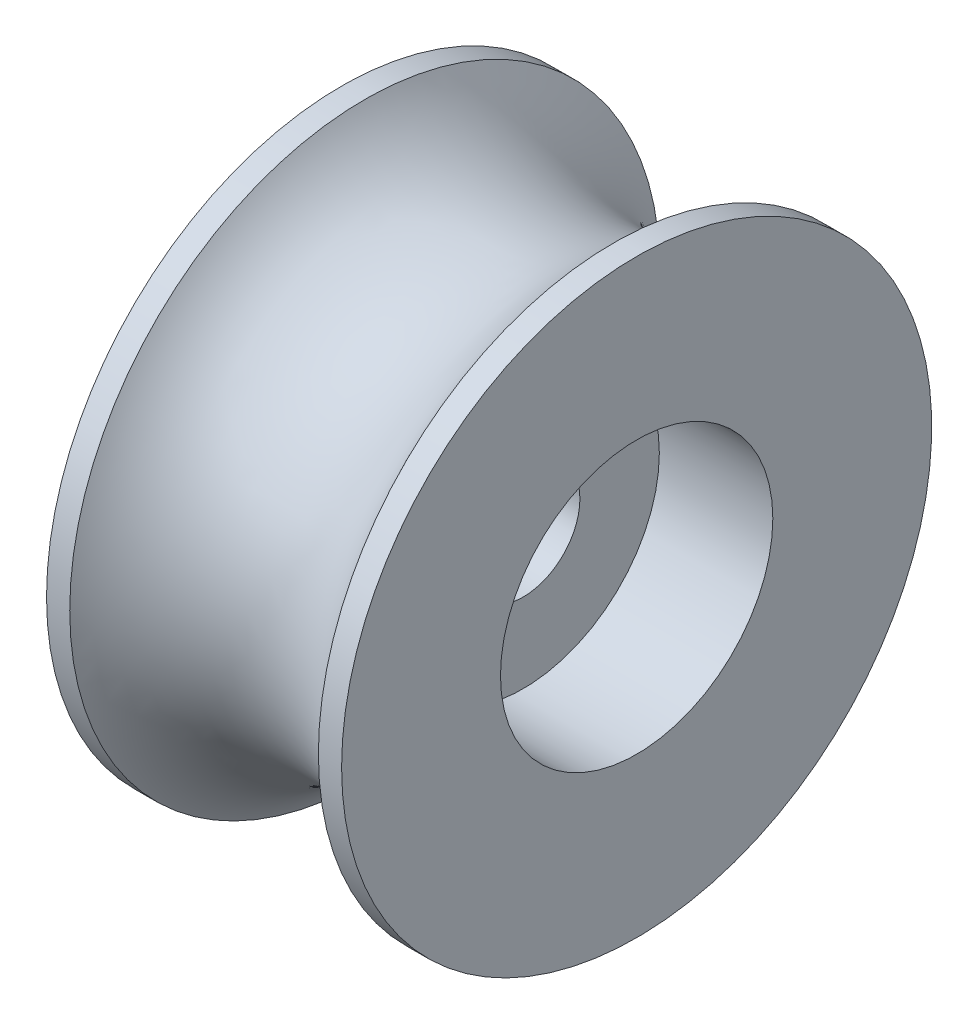
ISO-10303-21;
HEADER;
FILE_DESCRIPTION(('STEP AP214'),'2;1');
FILE_NAME('part.step','',(''),(''),'','','');
FILE_SCHEMA(('AUTOMOTIVE_DESIGN { 1 0 10303 214 1 1 1 1 }'));
ENDSEC;
DATA;
#1=APPLICATION_CONTEXT('core data for automotive mechanical design processes');
#2=APPLICATION_PROTOCOL_DEFINITION('international standard','automotive_design',2000,#1);
#3=PRODUCT_CONTEXT('',#1,'mechanical');
#4=PRODUCT('Part','Part','',(#3));
#5=PRODUCT_RELATED_PRODUCT_CATEGORY('part','',(#4));
#6=PRODUCT_DEFINITION_FORMATION('','',#4);
#7=PRODUCT_DEFINITION_CONTEXT('part definition',#1,'design');
#8=PRODUCT_DEFINITION('design','',#6,#7);
#9=PRODUCT_DEFINITION_SHAPE('','',#8);
#10=(LENGTH_UNIT() NAMED_UNIT(*) SI_UNIT(.MILLI.,.METRE.));
#11=(NAMED_UNIT(*) PLANE_ANGLE_UNIT() SI_UNIT($,.RADIAN.));
#12=(NAMED_UNIT(*) SI_UNIT($,.STERADIAN.) SOLID_ANGLE_UNIT());
#13=UNCERTAINTY_MEASURE_WITH_UNIT(LENGTH_MEASURE(1.E-05),#10,'distance_accuracy_value','');
#14=(GEOMETRIC_REPRESENTATION_CONTEXT(3) GLOBAL_UNCERTAINTY_ASSIGNED_CONTEXT((#13)) GLOBAL_UNIT_ASSIGNED_CONTEXT((#10,
#11,#12)) REPRESENTATION_CONTEXT('',''));
#15=CARTESIAN_POINT('',(0.,0.,0.));
#16=DIRECTION('',(0.,0.,1.));
#17=DIRECTION('',(1.,0.,0.));
#18=AXIS2_PLACEMENT_3D('',#15,#16,#17);
#19=CARTESIAN_POINT('',(-48.5,0.,6.5));
#20=DIRECTION('',(1.,0.,0.));
#21=DIRECTION('',(0.,0.,-1.));
#22=AXIS2_PLACEMENT_3D('',#19,#20,#21);
#23=CYLINDRICAL_SURFACE('',#22,2.5);
#24=CARTESIAN_POINT('',(1.5,0.,6.5));
#25=DIRECTION('',(1.,0.,0.));
#26=DIRECTION('',(0.,0.,-1.));
#27=AXIS2_PLACEMENT_3D('',#24,#25,#26);
#28=CIRCLE('',#27,2.5);
#29=CARTESIAN_POINT('',(1.5,0.,4.));
#30=VERTEX_POINT('',#29);
#31=EDGE_CURVE('E49',#30,#30,#28,.F.);
#32=ORIENTED_EDGE('',*,*,#31,.F.);
#33=EDGE_LOOP('',(#32));
#34=FACE_BOUND('',#33,.T.);
#35=CARTESIAN_POINT('',(-1.5,0.,6.5));
#36=DIRECTION('',(-1.,0.,0.));
#37=DIRECTION('',(0.,0.,1.));
#38=AXIS2_PLACEMENT_3D('',#35,#36,#37);
#39=CIRCLE('',#38,2.5);
#40=CARTESIAN_POINT('',(-1.5,0.,9.));
#41=VERTEX_POINT('',#40);
#42=EDGE_CURVE('E37',#41,#41,#39,.F.);
#43=ORIENTED_EDGE('',*,*,#42,.F.);
#44=EDGE_LOOP('',(#43));
#45=FACE_BOUND('',#44,.T.);
#46=ADVANCED_FACE('F33',(#34,#45),#23,.F.);
#47=CARTESIAN_POINT('',(6.5,0.,-6.5));
#48=DIRECTION('',(-1.,0.,0.));
#49=DIRECTION('',(0.,0.,1.));
#50=AXIS2_PLACEMENT_3D('',#47,#48,#49);
#51=PLANE('',#50);
#52=CARTESIAN_POINT('',(6.5,0.,6.5));
#53=DIRECTION('',(1.,0.,0.));
#54=DIRECTION('',(0.,0.,-1.));
#55=AXIS2_PLACEMENT_3D('',#52,#53,#54);
#56=CIRCLE('',#55,6.);
#57=CARTESIAN_POINT('',(6.5,0.,0.500000000000002));
#58=VERTEX_POINT('',#57);
#59=EDGE_CURVE('E58',#58,#58,#56,.T.);
#60=ORIENTED_EDGE('',*,*,#59,.F.);
#61=EDGE_LOOP('',(#60));
#62=FACE_BOUND('',#61,.T.);
#63=CARTESIAN_POINT('',(6.5,0.,6.5));
#64=DIRECTION('',(-1.,0.,0.));
#65=DIRECTION('',(0.,0.,1.));
#66=AXIS2_PLACEMENT_3D('',#63,#64,#65);
#67=CIRCLE('',#66,13.);
#68=CARTESIAN_POINT('',(6.5,0.,19.5));
#69=VERTEX_POINT('',#68);
#70=EDGE_CURVE('E10',#69,#69,#67,.T.);
#71=ORIENTED_EDGE('',*,*,#70,.F.);
#72=EDGE_LOOP('',(#71));
#73=FACE_BOUND('',#72,.T.);
#74=ADVANCED_FACE('F35',(#62,#73),#51,.F.);
#75=CARTESIAN_POINT('',(-6.5,0.,6.50000000000001));
#76=DIRECTION('',(-1.,0.,0.));
#77=DIRECTION('',(0.,0.,1.));
#78=AXIS2_PLACEMENT_3D('',#75,#76,#77);
#79=CYLINDRICAL_SURFACE('',#78,13.);
#80=CARTESIAN_POINT('',(5.47722557505166,0.,6.5));
#81=DIRECTION('',(-1.,0.,0.));
#82=DIRECTION('',(0.,0.,1.));
#83=AXIS2_PLACEMENT_3D('',#80,#81,#82);
#84=CIRCLE('',#83,13.);
#85=CARTESIAN_POINT('',(5.47722557505166,0.,19.5));
#86=VERTEX_POINT('',#85);
#87=EDGE_CURVE('E41',#86,#86,#84,.T.);
#88=ORIENTED_EDGE('',*,*,#87,.F.);
#89=EDGE_LOOP('',(#88));
#90=FACE_BOUND('',#89,.T.);
#91=ORIENTED_EDGE('',*,*,#70,.T.);
#92=EDGE_LOOP('',(#91));
#93=FACE_BOUND('',#92,.T.);
#94=ADVANCED_FACE('F75',(#90,#93),#79,.T.);
#95=CARTESIAN_POINT('',(0.,0.,6.50000000000001));
#96=DIRECTION('',(-1.,0.,0.));
#97=DIRECTION('',(0.,0.,1.));
#98=AXIS2_PLACEMENT_3D('',#95,#96,#97);
#99=TOROIDAL_SURFACE('',#98,16.5,6.5);
#100=CARTESIAN_POINT('',(-5.47722557505166,0.,6.50000000000001));
#101=DIRECTION('',(-1.,0.,0.));
#102=DIRECTION('',(0.,0.,1.));
#103=AXIS2_PLACEMENT_3D('',#100,#101,#102);
#104=CIRCLE('',#103,13.);
#105=CARTESIAN_POINT('',(-5.47722557505165,0.,19.5));
#106=VERTEX_POINT('',#105);
#107=EDGE_CURVE('E46',#106,#106,#104,.T.);
#108=ORIENTED_EDGE('',*,*,#107,.F.);
#109=EDGE_LOOP('',(#108));
#110=FACE_BOUND('',#109,.T.);
#111=ORIENTED_EDGE('',*,*,#87,.T.);
#112=EDGE_LOOP('',(#111));
#113=FACE_BOUND('',#112,.T.);
#114=ADVANCED_FACE('F72',(#110,#113),#99,.F.);
#115=CARTESIAN_POINT('',(-6.5,0.,6.50000000000001));
#116=DIRECTION('',(-1.,0.,0.));
#117=DIRECTION('',(0.,0.,1.));
#118=AXIS2_PLACEMENT_3D('',#115,#116,#117);
#119=CYLINDRICAL_SURFACE('',#118,13.);
#120=CARTESIAN_POINT('',(-6.5,0.,6.50000000000001));
#121=DIRECTION('',(-1.,0.,0.));
#122=DIRECTION('',(0.,0.,1.));
#123=AXIS2_PLACEMENT_3D('',#120,#121,#122);
#124=CIRCLE('',#123,13.);
#125=CARTESIAN_POINT('',(-6.5,0.,19.5));
#126=VERTEX_POINT('',#125);
#127=EDGE_CURVE('E51',#126,#126,#124,.T.);
#128=ORIENTED_EDGE('',*,*,#127,.F.);
#129=EDGE_LOOP('',(#128));
#130=FACE_BOUND('',#129,.T.);
#131=ORIENTED_EDGE('',*,*,#107,.T.);
#132=EDGE_LOOP('',(#131));
#133=FACE_BOUND('',#132,.T.);
#134=ADVANCED_FACE('F70',(#130,#133),#119,.T.);
#135=CARTESIAN_POINT('',(-6.5,0.,-6.49999999999999));
#136=DIRECTION('',(1.,0.,0.));
#137=DIRECTION('',(0.,0.,-1.));
#138=AXIS2_PLACEMENT_3D('',#135,#136,#137);
#139=PLANE('',#138);
#140=CARTESIAN_POINT('',(-6.5,0.,6.5));
#141=DIRECTION('',(-1.,0.,0.));
#142=DIRECTION('',(0.,0.,1.));
#143=AXIS2_PLACEMENT_3D('',#140,#141,#142);
#144=CIRCLE('',#143,6.);
#145=CARTESIAN_POINT('',(-6.5,0.,12.5));
#146=VERTEX_POINT('',#145);
#147=EDGE_CURVE('E65',#146,#146,#144,.T.);
#148=ORIENTED_EDGE('',*,*,#147,.F.);
#149=EDGE_LOOP('',(#148));
#150=FACE_BOUND('',#149,.T.);
#151=ORIENTED_EDGE('',*,*,#127,.T.);
#152=EDGE_LOOP('',(#151));
#153=FACE_BOUND('',#152,.T.);
#154=ADVANCED_FACE('F94',(#150,#153),#139,.F.);
#155=CARTESIAN_POINT('',(1.5,0.,6.5));
#156=DIRECTION('',(1.,0.,0.));
#157=DIRECTION('',(0.,0.,-1.));
#158=AXIS2_PLACEMENT_3D('',#155,#156,#157);
#159=PLANE('',#158);
#160=CARTESIAN_POINT('',(1.5,0.,6.5));
#161=DIRECTION('',(1.,0.,0.));
#162=DIRECTION('',(0.,0.,-1.));
#163=AXIS2_PLACEMENT_3D('',#160,#161,#162);
#164=CIRCLE('',#163,6.);
#165=CARTESIAN_POINT('',(1.5,0.,0.500000000000002));
#166=VERTEX_POINT('',#165);
#167=EDGE_CURVE('E52',#166,#166,#164,.T.);
#168=ORIENTED_EDGE('',*,*,#167,.T.);
#169=EDGE_LOOP('',(#168));
#170=FACE_BOUND('',#169,.T.);
#171=ORIENTED_EDGE('',*,*,#31,.T.);
#172=EDGE_LOOP('',(#171));
#173=FACE_BOUND('',#172,.T.);
#174=ADVANCED_FACE('F97',(#170,#173),#159,.T.);
#175=CARTESIAN_POINT('',(1.5,0.,6.5));
#176=DIRECTION('',(1.,0.,0.));
#177=DIRECTION('',(0.,0.,-1.));
#178=AXIS2_PLACEMENT_3D('',#175,#176,#177);
#179=CYLINDRICAL_SURFACE('',#178,6.);
#180=ORIENTED_EDGE('',*,*,#167,.F.);
#181=EDGE_LOOP('',(#180));
#182=FACE_BOUND('',#181,.T.);
#183=ORIENTED_EDGE('',*,*,#59,.T.);
#184=EDGE_LOOP('',(#183));
#185=FACE_BOUND('',#184,.T.);
#186=ADVANCED_FACE('F92',(#182,#185),#179,.F.);
#187=CARTESIAN_POINT('',(-1.5,0.,6.5));
#188=DIRECTION('',(-1.,0.,0.));
#189=DIRECTION('',(0.,0.,1.));
#190=AXIS2_PLACEMENT_3D('',#187,#188,#189);
#191=PLANE('',#190);
#192=CARTESIAN_POINT('',(-1.5,0.,6.5));
#193=DIRECTION('',(-1.,0.,0.));
#194=DIRECTION('',(0.,0.,1.));
#195=AXIS2_PLACEMENT_3D('',#192,#193,#194);
#196=CIRCLE('',#195,6.);
#197=CARTESIAN_POINT('',(-1.5,0.,12.5));
#198=VERTEX_POINT('',#197);
#199=EDGE_CURVE('E173',#198,#198,#196,.T.);
#200=ORIENTED_EDGE('',*,*,#199,.T.);
#201=EDGE_LOOP('',(#200));
#202=FACE_BOUND('',#201,.T.);
#203=ORIENTED_EDGE('',*,*,#42,.T.);
#204=EDGE_LOOP('',(#203));
#205=FACE_BOUND('',#204,.T.);
#206=ADVANCED_FACE('F124',(#202,#205),#191,.T.);
#207=CARTESIAN_POINT('',(-1.5,0.,6.5));
#208=DIRECTION('',(-1.,0.,0.));
#209=DIRECTION('',(0.,0.,1.));
#210=AXIS2_PLACEMENT_3D('',#207,#208,#209);
#211=CYLINDRICAL_SURFACE('',#210,6.);
#212=ORIENTED_EDGE('',*,*,#199,.F.);
#213=EDGE_LOOP('',(#212));
#214=FACE_BOUND('',#213,.T.);
#215=ORIENTED_EDGE('',*,*,#147,.T.);
#216=EDGE_LOOP('',(#215));
#217=FACE_BOUND('',#216,.T.);
#218=ADVANCED_FACE('F130',(#214,#217),#211,.F.);
#219=CLOSED_SHELL('',(#46,#74,#94,#114,#134,#154,#174,#186,#206,#218));
#220=MANIFOLD_SOLID_BREP('B2',#219);
#221=ADVANCED_BREP_SHAPE_REPRESENTATION('',(#18,#220),#14);
#222=SHAPE_DEFINITION_REPRESENTATION(#9,#221);
ENDSEC;
END-ISO-10303-21;
